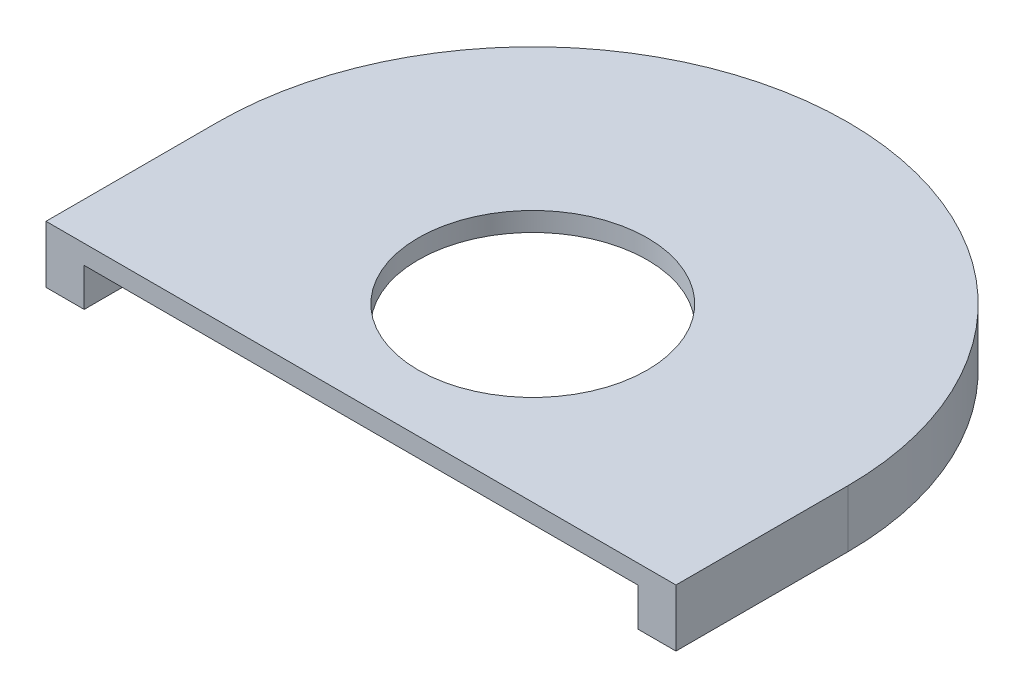
ISO-10303-21;
HEADER;
FILE_DESCRIPTION(('STEP AP214'),'2;1');
FILE_NAME('part.step','',(''),(''),'','','');
FILE_SCHEMA(('AUTOMOTIVE_DESIGN { 1 0 10303 214 1 1 1 1 }'));
ENDSEC;
DATA;
#1=APPLICATION_CONTEXT('core data for automotive mechanical design processes');
#2=APPLICATION_PROTOCOL_DEFINITION('international standard','automotive_design',2000,#1);
#3=PRODUCT_CONTEXT('',#1,'mechanical');
#4=PRODUCT('Part','Part','',(#3));
#5=PRODUCT_RELATED_PRODUCT_CATEGORY('part','',(#4));
#6=PRODUCT_DEFINITION_FORMATION('','',#4);
#7=PRODUCT_DEFINITION_CONTEXT('part definition',#1,'design');
#8=PRODUCT_DEFINITION('design','',#6,#7);
#9=PRODUCT_DEFINITION_SHAPE('','',#8);
#10=(LENGTH_UNIT() NAMED_UNIT(*) SI_UNIT(.MILLI.,.METRE.));
#11=(NAMED_UNIT(*) PLANE_ANGLE_UNIT() SI_UNIT($,.RADIAN.));
#12=(NAMED_UNIT(*) SI_UNIT($,.STERADIAN.) SOLID_ANGLE_UNIT());
#13=UNCERTAINTY_MEASURE_WITH_UNIT(LENGTH_MEASURE(1.E-05),#10,'distance_accuracy_value','');
#14=(GEOMETRIC_REPRESENTATION_CONTEXT(3) GLOBAL_UNCERTAINTY_ASSIGNED_CONTEXT((#13)) GLOBAL_UNIT_ASSIGNED_CONTEXT((#10,
#11,#12)) REPRESENTATION_CONTEXT('',''));
#15=CARTESIAN_POINT('',(0.,0.,0.));
#16=DIRECTION('',(0.,0.,1.));
#17=DIRECTION('',(1.,0.,0.));
#18=AXIS2_PLACEMENT_3D('',#15,#16,#17);
#19=CARTESIAN_POINT('',(0.,1.,0.));
#20=DIRECTION('',(0.,-1.,0.));
#21=DIRECTION('',(0.,0.,-1.));
#22=AXIS2_PLACEMENT_3D('',#19,#20,#21);
#23=CYLINDRICAL_SURFACE('',#22,6.);
#24=CARTESIAN_POINT('',(0.,1.,0.));
#25=DIRECTION('',(0.,1.,0.));
#26=DIRECTION('',(0.,0.,1.));
#27=AXIS2_PLACEMENT_3D('',#24,#25,#26);
#28=CIRCLE('',#27,6.);
#29=CARTESIAN_POINT('',(0.,1.,6.));
#30=VERTEX_POINT('',#29);
#31=EDGE_CURVE('E162',#30,#30,#28,.T.);
#32=ORIENTED_EDGE('',*,*,#31,.T.);
#33=EDGE_LOOP('',(#32));
#34=FACE_BOUND('',#33,.T.);
#35=CARTESIAN_POINT('',(0.,0.,0.));
#36=DIRECTION('',(0.,1.,0.));
#37=DIRECTION('',(0.,0.,1.));
#38=AXIS2_PLACEMENT_3D('',#35,#36,#37);
#39=CIRCLE('',#38,6.);
#40=CARTESIAN_POINT('',(0.,0.,6.));
#41=VERTEX_POINT('',#40);
#42=EDGE_CURVE('E150',#41,#41,#39,.T.);
#43=ORIENTED_EDGE('',*,*,#42,.F.);
#44=EDGE_LOOP('',(#43));
#45=FACE_BOUND('',#44,.T.);
#46=ADVANCED_FACE('F47',(#34,#45),#23,.F.);
#47=CARTESIAN_POINT('',(0.,1.,0.));
#48=DIRECTION('',(0.,1.,0.));
#49=DIRECTION('',(0.,0.,1.));
#50=AXIS2_PLACEMENT_3D('',#47,#48,#49);
#51=PLANE('',#50);
#52=DIRECTION('',(1.,0.,0.));
#53=VECTOR('',#52,1.);
#54=CARTESIAN_POINT('',(0.,1.,9.));
#55=LINE('',#54,#53);
#56=CARTESIAN_POINT('',(-16.5,1.,9.));
#57=VERTEX_POINT('',#56);
#58=CARTESIAN_POINT('',(16.5,1.,9.));
#59=VERTEX_POINT('',#58);
#60=EDGE_CURVE('E111',#57,#59,#55,.T.);
#61=ORIENTED_EDGE('',*,*,#60,.T.);
#62=DIRECTION('',(0.,0.,1.));
#63=VECTOR('',#62,1.);
#64=CARTESIAN_POINT('',(16.5,1.,0.));
#65=LINE('',#64,#63);
#66=CARTESIAN_POINT('',(16.5,1.,0.));
#67=VERTEX_POINT('',#66);
#68=EDGE_CURVE('E143',#67,#59,#65,.T.);
#69=ORIENTED_EDGE('',*,*,#68,.F.);
#70=CARTESIAN_POINT('',(0.,1.,0.));
#71=DIRECTION('',(0.,1.,0.));
#72=DIRECTION('',(0.,0.,1.));
#73=AXIS2_PLACEMENT_3D('',#70,#71,#72);
#74=CIRCLE('',#73,16.5);
#75=CARTESIAN_POINT('',(-16.5,1.,0.));
#76=VERTEX_POINT('',#75);
#77=EDGE_CURVE('E134',#67,#76,#74,.T.);
#78=ORIENTED_EDGE('',*,*,#77,.T.);
#79=DIRECTION('',(0.,0.,1.));
#80=VECTOR('',#79,1.);
#81=CARTESIAN_POINT('',(-16.5,1.,0.));
#82=LINE('',#81,#80);
#83=EDGE_CURVE('E125',#76,#57,#82,.T.);
#84=ORIENTED_EDGE('',*,*,#83,.T.);
#85=EDGE_LOOP('',(#61,#69,#78,#84));
#86=FACE_BOUND('',#85,.T.);
#87=ORIENTED_EDGE('',*,*,#31,.F.);
#88=EDGE_LOOP('',(#87));
#89=FACE_BOUND('',#88,.T.);
#90=ADVANCED_FACE('F131',(#86,#89),#51,.T.);
#91=CARTESIAN_POINT('',(0.,0.,0.));
#92=DIRECTION('',(0.,1.,0.));
#93=DIRECTION('',(0.,0.,1.));
#94=AXIS2_PLACEMENT_3D('',#91,#92,#93);
#95=PLANE('',#94);
#96=ORIENTED_EDGE('',*,*,#42,.T.);
#97=EDGE_LOOP('',(#96));
#98=FACE_BOUND('',#97,.T.);
#99=DIRECTION('',(0.,0.,1.));
#100=VECTOR('',#99,1.);
#101=CARTESIAN_POINT('',(14.5,0.,0.));
#102=LINE('',#101,#100);
#103=CARTESIAN_POINT('',(14.5,0.,0.));
#104=VERTEX_POINT('',#103);
#105=CARTESIAN_POINT('',(14.5,0.,9.));
#106=VERTEX_POINT('',#105);
#107=EDGE_CURVE('E166',#104,#106,#102,.T.);
#108=ORIENTED_EDGE('',*,*,#107,.T.);
#109=DIRECTION('',(-1.,0.,0.));
#110=VECTOR('',#109,1.);
#111=CARTESIAN_POINT('',(0.,0.,9.));
#112=LINE('',#111,#110);
#113=CARTESIAN_POINT('',(-14.5,0.,9.));
#114=VERTEX_POINT('',#113);
#115=EDGE_CURVE('E178',#106,#114,#112,.T.);
#116=ORIENTED_EDGE('',*,*,#115,.T.);
#117=DIRECTION('',(0.,0.,1.));
#118=VECTOR('',#117,1.);
#119=CARTESIAN_POINT('',(-14.5,0.,0.));
#120=LINE('',#119,#118);
#121=CARTESIAN_POINT('',(-14.5,0.,0.));
#122=VERTEX_POINT('',#121);
#123=EDGE_CURVE('E172',#122,#114,#120,.T.);
#124=ORIENTED_EDGE('',*,*,#123,.F.);
#125=CARTESIAN_POINT('',(0.,0.,0.));
#126=DIRECTION('',(0.,1.,0.));
#127=DIRECTION('',(0.,0.,1.));
#128=AXIS2_PLACEMENT_3D('',#125,#126,#127);
#129=CIRCLE('',#128,14.5);
#130=EDGE_CURVE('E70',#104,#122,#129,.T.);
#131=ORIENTED_EDGE('',*,*,#130,.F.);
#132=EDGE_LOOP('',(#108,#116,#124,#131));
#133=FACE_BOUND('',#132,.T.);
#134=ADVANCED_FACE('F177',(#98,#133),#95,.F.);
#135=CARTESIAN_POINT('',(-14.5,-2.,0.));
#136=DIRECTION('',(-1.,0.,0.));
#137=DIRECTION('',(0.,0.,1.));
#138=AXIS2_PLACEMENT_3D('',#135,#136,#137);
#139=PLANE('',#138);
#140=ORIENTED_EDGE('',*,*,#123,.T.);
#141=DIRECTION('',(0.,-1.,0.));
#142=VECTOR('',#141,1.);
#143=CARTESIAN_POINT('',(-14.5,-2.,9.));
#144=LINE('',#143,#142);
#145=CARTESIAN_POINT('',(-14.5,-2.,9.));
#146=VERTEX_POINT('',#145);
#147=EDGE_CURVE('E211',#114,#146,#144,.T.);
#148=ORIENTED_EDGE('',*,*,#147,.T.);
#149=DIRECTION('',(0.,0.,1.));
#150=VECTOR('',#149,1.);
#151=CARTESIAN_POINT('',(-14.5,-2.,0.));
#152=LINE('',#151,#150);
#153=CARTESIAN_POINT('',(-14.5,-2.,0.));
#154=VERTEX_POINT('',#153);
#155=EDGE_CURVE('E136',#154,#146,#152,.T.);
#156=ORIENTED_EDGE('',*,*,#155,.F.);
#157=DIRECTION('',(0.,1.,0.));
#158=VECTOR('',#157,1.);
#159=CARTESIAN_POINT('',(-14.5,-2.,0.));
#160=LINE('',#159,#158);
#161=EDGE_CURVE('E158',#154,#122,#160,.T.);
#162=ORIENTED_EDGE('',*,*,#161,.T.);
#163=EDGE_LOOP('',(#140,#148,#156,#162));
#164=FACE_BOUND('',#163,.T.);
#165=ADVANCED_FACE('F245',(#164),#139,.F.);
#166=CARTESIAN_POINT('',(14.5,-2.,0.));
#167=DIRECTION('',(1.,0.,0.));
#168=DIRECTION('',(0.,0.,-1.));
#169=AXIS2_PLACEMENT_3D('',#166,#167,#168);
#170=PLANE('',#169);
#171=DIRECTION('',(0.,0.,-1.));
#172=VECTOR('',#171,1.);
#173=CARTESIAN_POINT('',(14.5,-2.,0.));
#174=LINE('',#173,#172);
#175=CARTESIAN_POINT('',(14.5,-2.,9.));
#176=VERTEX_POINT('',#175);
#177=CARTESIAN_POINT('',(14.5,-2.,0.));
#178=VERTEX_POINT('',#177);
#179=EDGE_CURVE('E192',#176,#178,#174,.T.);
#180=ORIENTED_EDGE('',*,*,#179,.F.);
#181=DIRECTION('',(0.,1.,0.));
#182=VECTOR('',#181,1.);
#183=CARTESIAN_POINT('',(14.5,-2.,9.));
#184=LINE('',#183,#182);
#185=EDGE_CURVE('E185',#176,#106,#184,.T.);
#186=ORIENTED_EDGE('',*,*,#185,.T.);
#187=ORIENTED_EDGE('',*,*,#107,.F.);
#188=DIRECTION('',(0.,1.,0.));
#189=VECTOR('',#188,1.);
#190=CARTESIAN_POINT('',(14.5,-2.,0.));
#191=LINE('',#190,#189);
#192=EDGE_CURVE('E154',#178,#104,#191,.T.);
#193=ORIENTED_EDGE('',*,*,#192,.F.);
#194=EDGE_LOOP('',(#180,#186,#187,#193));
#195=FACE_BOUND('',#194,.T.);
#196=ADVANCED_FACE('F183',(#195),#170,.F.);
#197=CARTESIAN_POINT('',(0.,-2.,0.));
#198=DIRECTION('',(0.,1.,0.));
#199=DIRECTION('',(0.,0.,1.));
#200=AXIS2_PLACEMENT_3D('',#197,#198,#199);
#201=CYLINDRICAL_SURFACE('',#200,14.5);
#202=ORIENTED_EDGE('',*,*,#192,.T.);
#203=ORIENTED_EDGE('',*,*,#130,.T.);
#204=ORIENTED_EDGE('',*,*,#161,.F.);
#205=CARTESIAN_POINT('',(0.,-2.,0.));
#206=DIRECTION('',(0.,1.,0.));
#207=DIRECTION('',(0.,0.,1.));
#208=AXIS2_PLACEMENT_3D('',#205,#206,#207);
#209=CIRCLE('',#208,14.5);
#210=EDGE_CURVE('E141',#178,#154,#209,.T.);
#211=ORIENTED_EDGE('',*,*,#210,.F.);
#212=EDGE_LOOP('',(#202,#203,#204,#211));
#213=FACE_BOUND('',#212,.T.);
#214=ADVANCED_FACE('F187',(#213),#201,.F.);
#215=CARTESIAN_POINT('',(16.5,-2.,0.));
#216=DIRECTION('',(-1.,0.,0.));
#217=DIRECTION('',(0.,0.,1.));
#218=AXIS2_PLACEMENT_3D('',#215,#216,#217);
#219=PLANE('',#218);
#220=ORIENTED_EDGE('',*,*,#68,.T.);
#221=DIRECTION('',(0.,-1.,0.));
#222=VECTOR('',#221,1.);
#223=CARTESIAN_POINT('',(16.5,1.,9.));
#224=LINE('',#223,#222);
#225=CARTESIAN_POINT('',(16.5,-2.,9.));
#226=VERTEX_POINT('',#225);
#227=EDGE_CURVE('E114',#59,#226,#224,.T.);
#228=ORIENTED_EDGE('',*,*,#227,.T.);
#229=DIRECTION('',(0.,0.,1.));
#230=VECTOR('',#229,1.);
#231=CARTESIAN_POINT('',(16.5,-2.,0.));
#232=LINE('',#231,#230);
#233=CARTESIAN_POINT('',(16.5,-2.,0.));
#234=VERTEX_POINT('',#233);
#235=EDGE_CURVE('E195',#234,#226,#232,.T.);
#236=ORIENTED_EDGE('',*,*,#235,.F.);
#237=DIRECTION('',(0.,1.,0.));
#238=VECTOR('',#237,1.);
#239=CARTESIAN_POINT('',(16.5,-2.,0.));
#240=LINE('',#239,#238);
#241=EDGE_CURVE('E151',#234,#67,#240,.T.);
#242=ORIENTED_EDGE('',*,*,#241,.T.);
#243=EDGE_LOOP('',(#220,#228,#236,#242));
#244=FACE_BOUND('',#243,.T.);
#245=ADVANCED_FACE('F219',(#244),#219,.F.);
#246=CARTESIAN_POINT('',(-16.5,-2.,0.));
#247=DIRECTION('',(-1.,0.,0.));
#248=DIRECTION('',(0.,0.,1.));
#249=AXIS2_PLACEMENT_3D('',#246,#247,#248);
#250=PLANE('',#249);
#251=DIRECTION('',(0.,-1.,0.));
#252=VECTOR('',#251,1.);
#253=CARTESIAN_POINT('',(-16.5,1.,9.));
#254=LINE('',#253,#252);
#255=CARTESIAN_POINT('',(-16.5,-2.,9.));
#256=VERTEX_POINT('',#255);
#257=EDGE_CURVE('E62',#57,#256,#254,.T.);
#258=ORIENTED_EDGE('',*,*,#257,.F.);
#259=ORIENTED_EDGE('',*,*,#83,.F.);
#260=DIRECTION('',(0.,1.,0.));
#261=VECTOR('',#260,1.);
#262=CARTESIAN_POINT('',(-16.5,-2.,0.));
#263=LINE('',#262,#261);
#264=CARTESIAN_POINT('',(-16.5,-2.,0.));
#265=VERTEX_POINT('',#264);
#266=EDGE_CURVE('E147',#265,#76,#263,.T.);
#267=ORIENTED_EDGE('',*,*,#266,.F.);
#268=DIRECTION('',(0.,0.,1.));
#269=VECTOR('',#268,1.);
#270=CARTESIAN_POINT('',(-16.5,-2.,0.));
#271=LINE('',#270,#269);
#272=EDGE_CURVE('E128',#265,#256,#271,.T.);
#273=ORIENTED_EDGE('',*,*,#272,.T.);
#274=EDGE_LOOP('',(#258,#259,#267,#273));
#275=FACE_BOUND('',#274,.T.);
#276=ADVANCED_FACE('F124',(#275),#250,.T.);
#277=CARTESIAN_POINT('',(0.,-2.,0.));
#278=DIRECTION('',(0.,1.,0.));
#279=DIRECTION('',(0.,0.,1.));
#280=AXIS2_PLACEMENT_3D('',#277,#278,#279);
#281=CYLINDRICAL_SURFACE('',#280,16.5);
#282=ORIENTED_EDGE('',*,*,#77,.F.);
#283=ORIENTED_EDGE('',*,*,#241,.F.);
#284=CARTESIAN_POINT('',(0.,-2.,0.));
#285=DIRECTION('',(0.,1.,0.));
#286=DIRECTION('',(0.,0.,1.));
#287=AXIS2_PLACEMENT_3D('',#284,#285,#286);
#288=CIRCLE('',#287,16.5);
#289=EDGE_CURVE('E202',#234,#265,#288,.T.);
#290=ORIENTED_EDGE('',*,*,#289,.T.);
#291=ORIENTED_EDGE('',*,*,#266,.T.);
#292=EDGE_LOOP('',(#282,#283,#290,#291));
#293=FACE_BOUND('',#292,.T.);
#294=ADVANCED_FACE('F223',(#293),#281,.T.);
#295=CARTESIAN_POINT('',(0.,-2.,0.));
#296=DIRECTION('',(0.,1.,0.));
#297=DIRECTION('',(0.,0.,1.));
#298=AXIS2_PLACEMENT_3D('',#295,#296,#297);
#299=PLANE('',#298);
#300=ORIENTED_EDGE('',*,*,#235,.T.);
#301=DIRECTION('',(-1.,0.,0.));
#302=VECTOR('',#301,1.);
#303=CARTESIAN_POINT('',(0.,-2.,9.));
#304=LINE('',#303,#302);
#305=EDGE_CURVE('E11',#226,#176,#304,.T.);
#306=ORIENTED_EDGE('',*,*,#305,.T.);
#307=ORIENTED_EDGE('',*,*,#179,.T.);
#308=ORIENTED_EDGE('',*,*,#210,.T.);
#309=ORIENTED_EDGE('',*,*,#155,.T.);
#310=EDGE_CURVE('E50',#146,#256,#304,.T.);
#311=ORIENTED_EDGE('',*,*,#310,.T.);
#312=ORIENTED_EDGE('',*,*,#272,.F.);
#313=ORIENTED_EDGE('',*,*,#289,.F.);
#314=EDGE_LOOP('',(#300,#306,#307,#308,#309,#311,#312,#313));
#315=FACE_BOUND('',#314,.T.);
#316=ADVANCED_FACE('F221',(#315),#299,.F.);
#317=CARTESIAN_POINT('',(0.,1.,9.));
#318=DIRECTION('',(0.,0.,-1.));
#319=DIRECTION('',(-1.,0.,0.));
#320=AXIS2_PLACEMENT_3D('',#317,#318,#319);
#321=PLANE('',#320);
#322=ORIENTED_EDGE('',*,*,#227,.F.);
#323=ORIENTED_EDGE('',*,*,#60,.F.);
#324=ORIENTED_EDGE('',*,*,#257,.T.);
#325=ORIENTED_EDGE('',*,*,#310,.F.);
#326=ORIENTED_EDGE('',*,*,#147,.F.);
#327=ORIENTED_EDGE('',*,*,#115,.F.);
#328=ORIENTED_EDGE('',*,*,#185,.F.);
#329=ORIENTED_EDGE('',*,*,#305,.F.);
#330=EDGE_LOOP('',(#322,#323,#324,#325,#326,#327,#328,#329));
#331=FACE_BOUND('',#330,.T.);
#332=ADVANCED_FACE('F112',(#331),#321,.F.);
#333=CLOSED_SHELL('',(#46,#90,#134,#165,#196,#214,#245,#276,#294,#316,#332));
#334=MANIFOLD_SOLID_BREP('B2',#333);
#335=ADVANCED_BREP_SHAPE_REPRESENTATION('',(#18,#334),#14);
#336=SHAPE_DEFINITION_REPRESENTATION(#9,#335);
ENDSEC;
END-ISO-10303-21;
